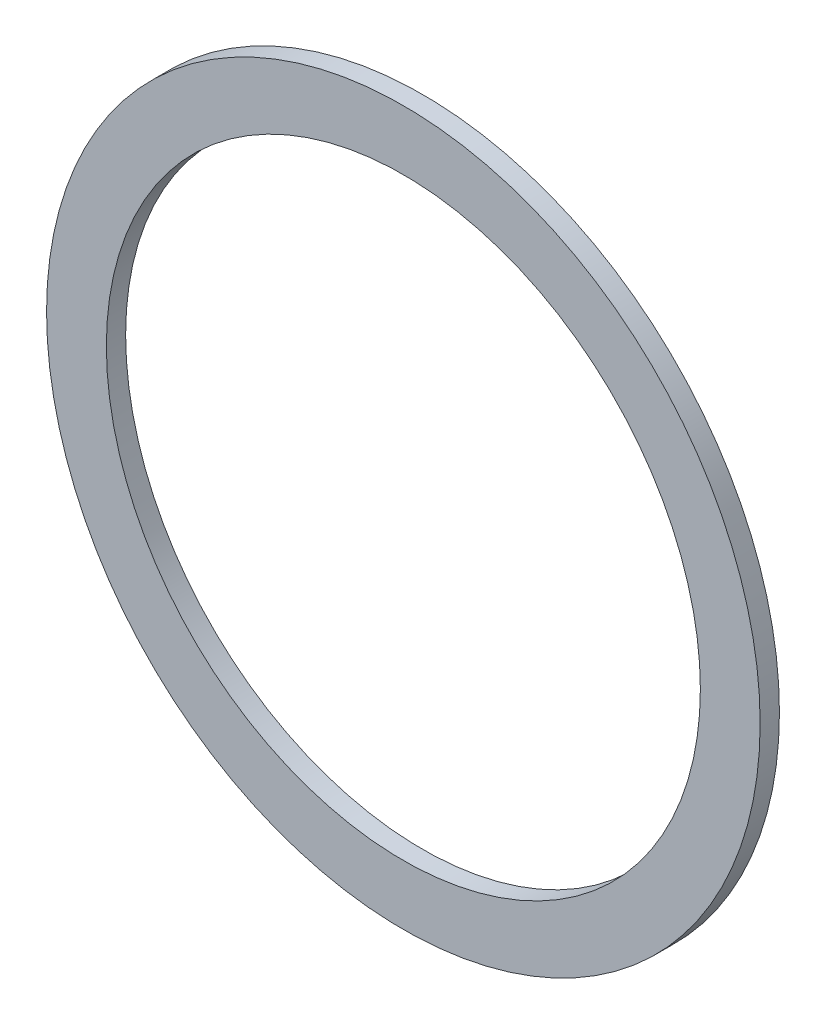
ISO-10303-21;
HEADER;
FILE_DESCRIPTION(('STEP AP214'),'2;1');
FILE_NAME('part.step','',(''),(''),'','','');
FILE_SCHEMA(('AUTOMOTIVE_DESIGN { 1 0 10303 214 1 1 1 1 }'));
ENDSEC;
DATA;
#1=APPLICATION_CONTEXT('core data for automotive mechanical design processes');
#2=APPLICATION_PROTOCOL_DEFINITION('international standard','automotive_design',2000,#1);
#3=PRODUCT_CONTEXT('',#1,'mechanical');
#4=PRODUCT('Part','Part','',(#3));
#5=PRODUCT_RELATED_PRODUCT_CATEGORY('part','',(#4));
#6=PRODUCT_DEFINITION_FORMATION('','',#4);
#7=PRODUCT_DEFINITION_CONTEXT('part definition',#1,'design');
#8=PRODUCT_DEFINITION('design','',#6,#7);
#9=PRODUCT_DEFINITION_SHAPE('','',#8);
#10=(LENGTH_UNIT() NAMED_UNIT(*) SI_UNIT(.MILLI.,.METRE.));
#11=(NAMED_UNIT(*) PLANE_ANGLE_UNIT() SI_UNIT($,.RADIAN.));
#12=(NAMED_UNIT(*) SI_UNIT($,.STERADIAN.) SOLID_ANGLE_UNIT());
#13=UNCERTAINTY_MEASURE_WITH_UNIT(LENGTH_MEASURE(1.E-05),#10,'distance_accuracy_value','');
#14=(GEOMETRIC_REPRESENTATION_CONTEXT(3) GLOBAL_UNCERTAINTY_ASSIGNED_CONTEXT((#13)) GLOBAL_UNIT_ASSIGNED_CONTEXT((#10,
#11,#12)) REPRESENTATION_CONTEXT('',''));
#15=CARTESIAN_POINT('',(0.,0.,0.));
#16=DIRECTION('',(0.,0.,1.));
#17=DIRECTION('',(1.,0.,0.));
#18=AXIS2_PLACEMENT_3D('',#15,#16,#17);
#19=CARTESIAN_POINT('',(0.,0.,17.5));
#20=DIRECTION('',(0.,0.,1.));
#21=DIRECTION('',(1.,0.,0.));
#22=AXIS2_PLACEMENT_3D('',#19,#20,#21);
#23=PLANE('',#22);
#24=CARTESIAN_POINT('',(0.,0.,17.5));
#25=DIRECTION('',(0.,0.,1.));
#26=DIRECTION('',(1.,0.,0.));
#27=AXIS2_PLACEMENT_3D('',#24,#25,#26);
#28=CIRCLE('',#27,18.5);
#29=CARTESIAN_POINT('',(18.5,0.,17.5));
#30=VERTEX_POINT('',#29);
#31=EDGE_CURVE('E10',#30,#30,#28,.T.);
#32=ORIENTED_EDGE('',*,*,#31,.T.);
#33=EDGE_LOOP('',(#32));
#34=FACE_BOUND('',#33,.T.);
#35=CARTESIAN_POINT('',(0.,0.,17.5));
#36=DIRECTION('',(0.,0.,1.));
#37=DIRECTION('',(1.,0.,0.));
#38=AXIS2_PLACEMENT_3D('',#35,#36,#37);
#39=CIRCLE('',#38,15.4);
#40=CARTESIAN_POINT('',(15.4,0.,17.5));
#41=VERTEX_POINT('',#40);
#42=EDGE_CURVE('E51',#41,#41,#39,.T.);
#43=ORIENTED_EDGE('',*,*,#42,.F.);
#44=EDGE_LOOP('',(#43));
#45=FACE_BOUND('',#44,.T.);
#46=ADVANCED_FACE('F36',(#34,#45),#23,.T.);
#47=CARTESIAN_POINT('',(0.,0.,16.5));
#48=DIRECTION('',(0.,0.,1.));
#49=DIRECTION('',(1.,0.,0.));
#50=AXIS2_PLACEMENT_3D('',#47,#48,#49);
#51=PLANE('',#50);
#52=CARTESIAN_POINT('',(0.,0.,16.5));
#53=DIRECTION('',(0.,0.,1.));
#54=DIRECTION('',(1.,0.,0.));
#55=AXIS2_PLACEMENT_3D('',#52,#53,#54);
#56=CIRCLE('',#55,18.5);
#57=CARTESIAN_POINT('',(18.5,0.,16.5));
#58=VERTEX_POINT('',#57);
#59=EDGE_CURVE('E40',#58,#58,#56,.T.);
#60=ORIENTED_EDGE('',*,*,#59,.F.);
#61=EDGE_LOOP('',(#60));
#62=FACE_BOUND('',#61,.T.);
#63=CARTESIAN_POINT('',(0.,0.,16.5));
#64=DIRECTION('',(0.,0.,1.));
#65=DIRECTION('',(1.,0.,0.));
#66=AXIS2_PLACEMENT_3D('',#63,#64,#65);
#67=CIRCLE('',#66,15.4);
#68=CARTESIAN_POINT('',(15.4,0.,16.5));
#69=VERTEX_POINT('',#68);
#70=EDGE_CURVE('E53',#69,#69,#67,.T.);
#71=ORIENTED_EDGE('',*,*,#70,.T.);
#72=EDGE_LOOP('',(#71));
#73=FACE_BOUND('',#72,.T.);
#74=ADVANCED_FACE('F63',(#62,#73),#51,.F.);
#75=CARTESIAN_POINT('',(0.,0.,17.5));
#76=DIRECTION('',(0.,0.,-1.));
#77=DIRECTION('',(-1.,0.,0.));
#78=AXIS2_PLACEMENT_3D('',#75,#76,#77);
#79=CYLINDRICAL_SURFACE('',#78,18.5);
#80=ORIENTED_EDGE('',*,*,#31,.F.);
#81=EDGE_LOOP('',(#80));
#82=FACE_BOUND('',#81,.T.);
#83=ORIENTED_EDGE('',*,*,#59,.T.);
#84=EDGE_LOOP('',(#83));
#85=FACE_BOUND('',#84,.T.);
#86=ADVANCED_FACE('F38',(#82,#85),#79,.T.);
#87=CARTESIAN_POINT('',(0.,0.,17.5));
#88=DIRECTION('',(0.,0.,-1.));
#89=DIRECTION('',(-1.,0.,0.));
#90=AXIS2_PLACEMENT_3D('',#87,#88,#89);
#91=CYLINDRICAL_SURFACE('',#90,15.4);
#92=ORIENTED_EDGE('',*,*,#42,.T.);
#93=EDGE_LOOP('',(#92));
#94=FACE_BOUND('',#93,.T.);
#95=ORIENTED_EDGE('',*,*,#70,.F.);
#96=EDGE_LOOP('',(#95));
#97=FACE_BOUND('',#96,.T.);
#98=ADVANCED_FACE('F59',(#94,#97),#91,.F.);
#99=CLOSED_SHELL('',(#46,#74,#86,#98));
#100=MANIFOLD_SOLID_BREP('B2',#99);
#101=ADVANCED_BREP_SHAPE_REPRESENTATION('',(#18,#100),#14);
#102=SHAPE_DEFINITION_REPRESENTATION(#9,#101);
ENDSEC;
END-ISO-10303-21;
